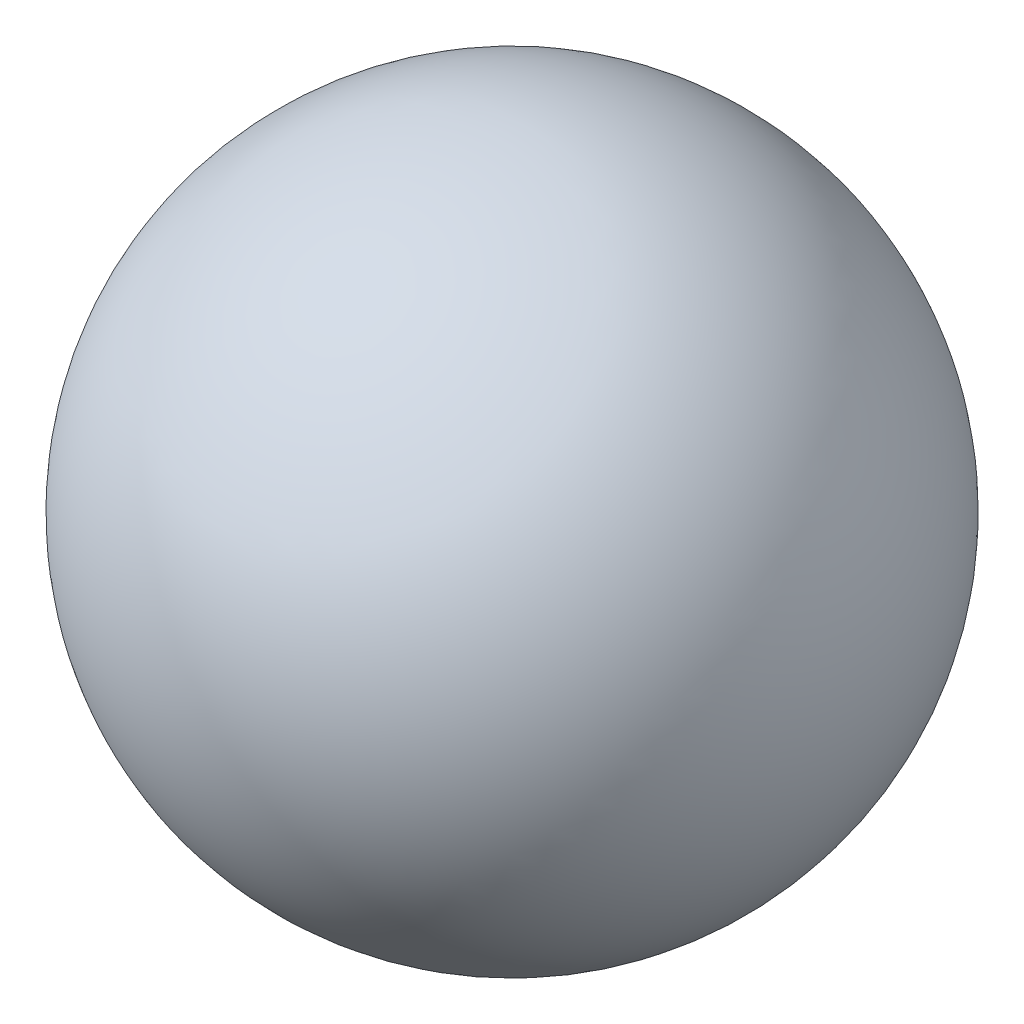
ISO-10303-21;
HEADER;
FILE_DESCRIPTION(('STEP AP214'),'2;1');
FILE_NAME('part.step','',(''),(''),'','','');
FILE_SCHEMA(('AUTOMOTIVE_DESIGN { 1 0 10303 214 1 1 1 1 }'));
ENDSEC;
DATA;
#1=APPLICATION_CONTEXT('core data for automotive mechanical design processes');
#2=APPLICATION_PROTOCOL_DEFINITION('international standard','automotive_design',2000,#1);
#3=PRODUCT_CONTEXT('',#1,'mechanical');
#4=PRODUCT('Part','Part','',(#3));
#5=PRODUCT_RELATED_PRODUCT_CATEGORY('part','',(#4));
#6=PRODUCT_DEFINITION_FORMATION('','',#4);
#7=PRODUCT_DEFINITION_CONTEXT('part definition',#1,'design');
#8=PRODUCT_DEFINITION('design','',#6,#7);
#9=PRODUCT_DEFINITION_SHAPE('','',#8);
#10=(LENGTH_UNIT() NAMED_UNIT(*) SI_UNIT(.MILLI.,.METRE.));
#11=(NAMED_UNIT(*) PLANE_ANGLE_UNIT() SI_UNIT($,.RADIAN.));
#12=(NAMED_UNIT(*) SI_UNIT($,.STERADIAN.) SOLID_ANGLE_UNIT());
#13=UNCERTAINTY_MEASURE_WITH_UNIT(LENGTH_MEASURE(1.E-05),#10,'distance_accuracy_value','');
#14=(GEOMETRIC_REPRESENTATION_CONTEXT(3) GLOBAL_UNCERTAINTY_ASSIGNED_CONTEXT((#13)) GLOBAL_UNIT_ASSIGNED_CONTEXT((#10,
#11,#12)) REPRESENTATION_CONTEXT('',''));
#15=CARTESIAN_POINT('',(0.,0.,0.));
#16=DIRECTION('',(0.,0.,1.));
#17=DIRECTION('',(1.,0.,0.));
#18=AXIS2_PLACEMENT_3D('',#15,#16,#17);
#19=CARTESIAN_POINT('',(0.,0.,0.));
#20=DIRECTION('',(0.,0.,-1.));
#21=DIRECTION('',(0.,-1.,0.));
#22=AXIS2_PLACEMENT_3D('',#19,#20,#21);
#23=SPHERICAL_SURFACE('',#22,6.35);
#24=CARTESIAN_POINT('',(0.,0.,-6.35));
#25=VERTEX_POINT('',#24);
#26=VERTEX_LOOP('',#25);
#27=FACE_BOUND('',#26,.T.);
#28=ADVANCED_FACE('F39',(#27),#23,.T.);
#29=CLOSED_SHELL('',(#28));
#30=MANIFOLD_SOLID_BREP('B2',#29);
#31=ADVANCED_BREP_SHAPE_REPRESENTATION('',(#18,#30),#14);
#32=SHAPE_DEFINITION_REPRESENTATION(#9,#31);
ENDSEC;
END-ISO-10303-21;
